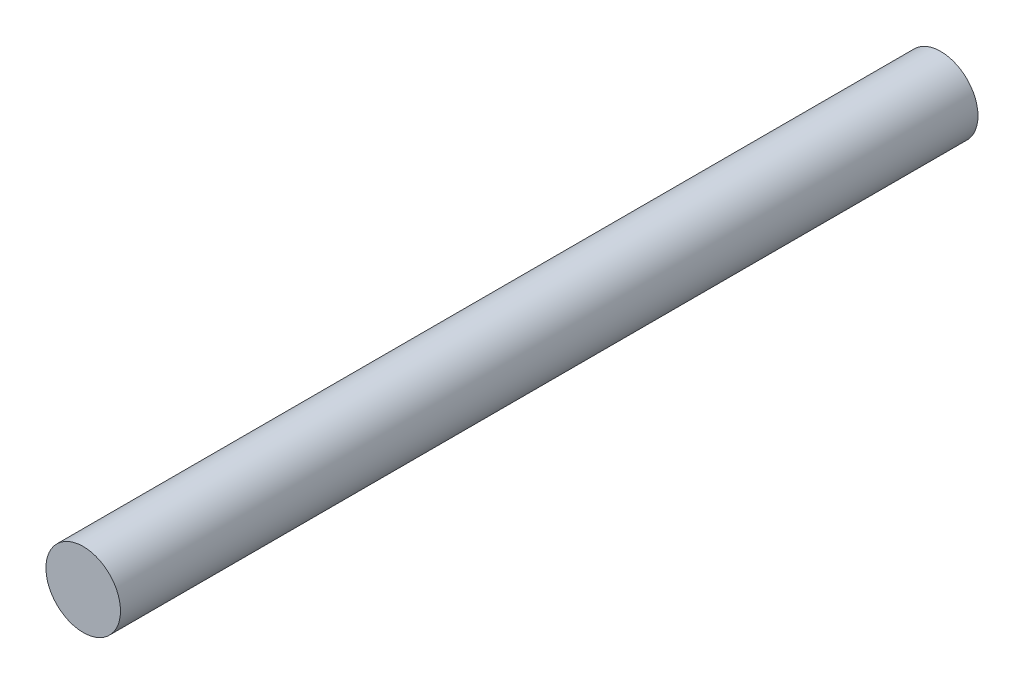
ISO-10303-21;
HEADER;
FILE_DESCRIPTION(('STEP AP214'),'2;1');
FILE_NAME('part.step','',(''),(''),'','','');
FILE_SCHEMA(('AUTOMOTIVE_DESIGN { 1 0 10303 214 1 1 1 1 }'));
ENDSEC;
DATA;
#1=APPLICATION_CONTEXT('core data for automotive mechanical design processes');
#2=APPLICATION_PROTOCOL_DEFINITION('international standard','automotive_design',2000,#1);
#3=PRODUCT_CONTEXT('',#1,'mechanical');
#4=PRODUCT('Part','Part','',(#3));
#5=PRODUCT_RELATED_PRODUCT_CATEGORY('part','',(#4));
#6=PRODUCT_DEFINITION_FORMATION('','',#4);
#7=PRODUCT_DEFINITION_CONTEXT('part definition',#1,'design');
#8=PRODUCT_DEFINITION('design','',#6,#7);
#9=PRODUCT_DEFINITION_SHAPE('','',#8);
#10=(LENGTH_UNIT() NAMED_UNIT(*) SI_UNIT(.MILLI.,.METRE.));
#11=(NAMED_UNIT(*) PLANE_ANGLE_UNIT() SI_UNIT($,.RADIAN.));
#12=(NAMED_UNIT(*) SI_UNIT($,.STERADIAN.) SOLID_ANGLE_UNIT());
#13=UNCERTAINTY_MEASURE_WITH_UNIT(LENGTH_MEASURE(1.E-05),#10,'distance_accuracy_value','');
#14=(GEOMETRIC_REPRESENTATION_CONTEXT(3) GLOBAL_UNCERTAINTY_ASSIGNED_CONTEXT((#13)) GLOBAL_UNIT_ASSIGNED_CONTEXT((#10,
#11,#12)) REPRESENTATION_CONTEXT('',''));
#15=CARTESIAN_POINT('',(0.,0.,0.));
#16=DIRECTION('',(0.,0.,1.));
#17=DIRECTION('',(1.,0.,0.));
#18=AXIS2_PLACEMENT_3D('',#15,#16,#17);
#19=CARTESIAN_POINT('',(0.,0.,46.));
#20=DIRECTION('',(0.,0.,-1.));
#21=DIRECTION('',(-1.,0.,0.));
#22=AXIS2_PLACEMENT_3D('',#19,#20,#21);
#23=CYLINDRICAL_SURFACE('',#22,2.);
#24=CARTESIAN_POINT('',(0.,0.,46.));
#25=DIRECTION('',(0.,0.,1.));
#26=DIRECTION('',(1.,0.,0.));
#27=AXIS2_PLACEMENT_3D('',#24,#25,#26);
#28=CIRCLE('',#27,2.);
#29=CARTESIAN_POINT('',(2.,0.,46.));
#30=VERTEX_POINT('',#29);
#31=EDGE_CURVE('E10',#30,#30,#28,.T.);
#32=ORIENTED_EDGE('',*,*,#31,.F.);
#33=EDGE_LOOP('',(#32));
#34=FACE_BOUND('',#33,.T.);
#35=CARTESIAN_POINT('',(0.,0.,0.));
#36=DIRECTION('',(0.,0.,1.));
#37=DIRECTION('',(1.,0.,0.));
#38=AXIS2_PLACEMENT_3D('',#35,#36,#37);
#39=CIRCLE('',#38,2.);
#40=CARTESIAN_POINT('',(2.,0.,0.));
#41=VERTEX_POINT('',#40);
#42=EDGE_CURVE('E34',#41,#41,#39,.T.);
#43=ORIENTED_EDGE('',*,*,#42,.T.);
#44=EDGE_LOOP('',(#43));
#45=FACE_BOUND('',#44,.T.);
#46=ADVANCED_FACE('F31',(#34,#45),#23,.T.);
#47=CARTESIAN_POINT('',(0.,0.,46.));
#48=DIRECTION('',(0.,0.,1.));
#49=DIRECTION('',(1.,0.,0.));
#50=AXIS2_PLACEMENT_3D('',#47,#48,#49);
#51=PLANE('',#50);
#52=ORIENTED_EDGE('',*,*,#31,.T.);
#53=EDGE_LOOP('',(#52));
#54=FACE_BOUND('',#53,.T.);
#55=ADVANCED_FACE('F46',(#54),#51,.T.);
#56=CARTESIAN_POINT('',(0.,0.,0.));
#57=DIRECTION('',(0.,0.,1.));
#58=DIRECTION('',(1.,0.,0.));
#59=AXIS2_PLACEMENT_3D('',#56,#57,#58);
#60=PLANE('',#59);
#61=ORIENTED_EDGE('',*,*,#42,.F.);
#62=EDGE_LOOP('',(#61));
#63=FACE_BOUND('',#62,.T.);
#64=ADVANCED_FACE('F44',(#63),#60,.F.);
#65=CLOSED_SHELL('',(#46,#55,#64));
#66=MANIFOLD_SOLID_BREP('B2',#65);
#67=ADVANCED_BREP_SHAPE_REPRESENTATION('',(#18,#66),#14);
#68=SHAPE_DEFINITION_REPRESENTATION(#9,#67);
ENDSEC;
END-ISO-10303-21;
